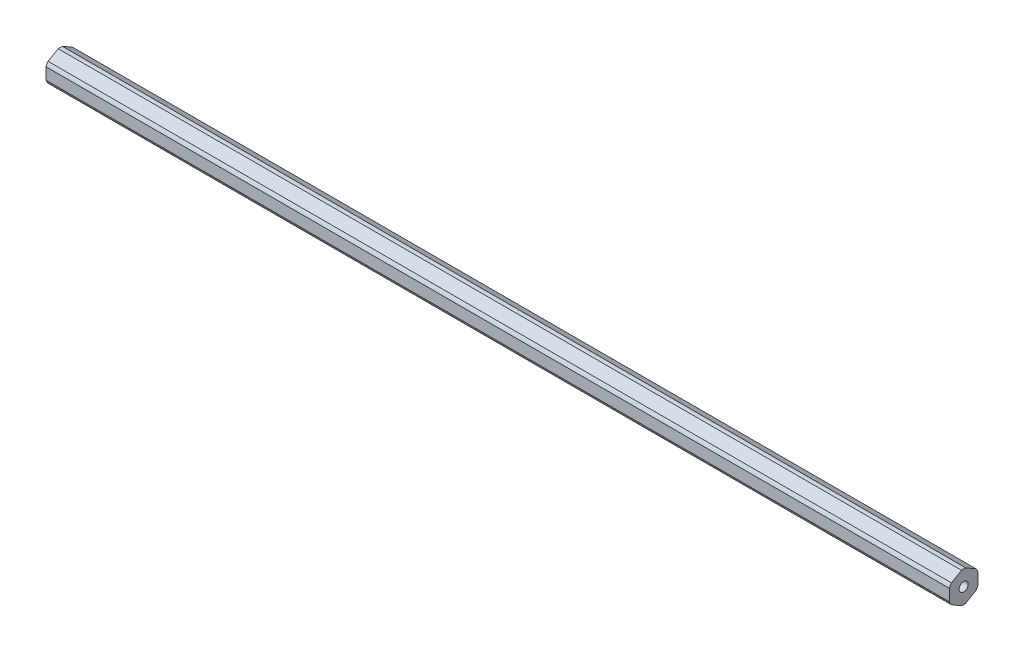
ISO-10303-21;
HEADER;
FILE_DESCRIPTION(('STEP AP214'),'2;1');
FILE_NAME('part.step','',(''),(''),'','','');
FILE_SCHEMA(('AUTOMOTIVE_DESIGN { 1 0 10303 214 1 1 1 1 }'));
ENDSEC;
DATA;
#1=APPLICATION_CONTEXT('core data for automotive mechanical design processes');
#2=APPLICATION_PROTOCOL_DEFINITION('international standard','automotive_design',2000,#1);
#3=PRODUCT_CONTEXT('',#1,'mechanical');
#4=PRODUCT('Part','Part','',(#3));
#5=PRODUCT_RELATED_PRODUCT_CATEGORY('part','',(#4));
#6=PRODUCT_DEFINITION_FORMATION('','',#4);
#7=PRODUCT_DEFINITION_CONTEXT('part definition',#1,'design');
#8=PRODUCT_DEFINITION('design','',#6,#7);
#9=PRODUCT_DEFINITION_SHAPE('','',#8);
#10=(LENGTH_UNIT() NAMED_UNIT(*) SI_UNIT(.MILLI.,.METRE.));
#11=(NAMED_UNIT(*) PLANE_ANGLE_UNIT() SI_UNIT($,.RADIAN.));
#12=(NAMED_UNIT(*) SI_UNIT($,.STERADIAN.) SOLID_ANGLE_UNIT());
#13=UNCERTAINTY_MEASURE_WITH_UNIT(LENGTH_MEASURE(1.E-05),#10,'distance_accuracy_value','');
#14=(GEOMETRIC_REPRESENTATION_CONTEXT(3) GLOBAL_UNCERTAINTY_ASSIGNED_CONTEXT((#13)) GLOBAL_UNIT_ASSIGNED_CONTEXT((#10,
#11,#12)) REPRESENTATION_CONTEXT('',''));
#15=CARTESIAN_POINT('',(0.,0.,0.));
#16=DIRECTION('',(0.,0.,1.));
#17=DIRECTION('',(1.,0.,0.));
#18=AXIS2_PLACEMENT_3D('',#15,#16,#17);
#19=CARTESIAN_POINT('',(200.025,0.,-6.35));
#20=DIRECTION('',(0.,0.,1.));
#21=DIRECTION('',(0.,-1.,0.));
#22=AXIS2_PLACEMENT_3D('',#19,#20,#21);
#23=PLANE('',#22);
#24=DIRECTION('',(0.,1.,0.));
#25=VECTOR('',#24,1.);
#26=CARTESIAN_POINT('',(-200.025,0.,-6.35));
#27=LINE('',#26,#25);
#28=CARTESIAN_POINT('',(-200.025,-2.59030191290513,-6.35));
#29=VERTEX_POINT('',#28);
#30=CARTESIAN_POINT('',(-200.025,2.59030191290514,-6.35));
#31=VERTEX_POINT('',#30);
#32=EDGE_CURVE('E169',#29,#31,#27,.T.);
#33=ORIENTED_EDGE('',*,*,#32,.T.);
#34=DIRECTION('',(-1.,0.,0.));
#35=VECTOR('',#34,1.);
#36=CARTESIAN_POINT('',(200.025,2.59030191290514,-6.35));
#37=LINE('',#36,#35);
#38=CARTESIAN_POINT('',(200.025,2.59030191290514,-6.35));
#39=VERTEX_POINT('',#38);
#40=EDGE_CURVE('E11',#39,#31,#37,.T.);
#41=ORIENTED_EDGE('',*,*,#40,.F.);
#42=DIRECTION('',(0.,1.,0.));
#43=VECTOR('',#42,1.);
#44=CARTESIAN_POINT('',(200.025,0.,-6.35));
#45=LINE('',#44,#43);
#46=CARTESIAN_POINT('',(200.025,-2.59030191290513,-6.35));
#47=VERTEX_POINT('',#46);
#48=EDGE_CURVE('E227',#47,#39,#45,.T.);
#49=ORIENTED_EDGE('',*,*,#48,.F.);
#50=DIRECTION('',(-1.,0.,0.));
#51=VECTOR('',#50,1.);
#52=CARTESIAN_POINT('',(200.025,-2.59030191290513,-6.35));
#53=LINE('',#52,#51);
#54=EDGE_CURVE('E165',#47,#29,#53,.T.);
#55=ORIENTED_EDGE('',*,*,#54,.T.);
#56=EDGE_LOOP('',(#33,#41,#49,#55));
#57=FACE_BOUND('',#56,.T.);
#58=ADVANCED_FACE('F45',(#57),#23,.F.);
#59=CARTESIAN_POINT('',(200.025,0.,0.));
#60=DIRECTION('',(-1.,0.,0.));
#61=DIRECTION('',(0.,0.,1.));
#62=AXIS2_PLACEMENT_3D('',#59,#60,#61);
#63=CYLINDRICAL_SURFACE('',#62,6.858);
#64=CARTESIAN_POINT('',(-200.025,0.,0.));
#65=DIRECTION('',(1.,0.,0.));
#66=DIRECTION('',(0.,0.,-1.));
#67=AXIS2_PLACEMENT_3D('',#64,#65,#66);
#68=CIRCLE('',#67,6.858);
#69=CARTESIAN_POINT('',(-200.025,4.20411035757862,-5.41826726004727));
#70=VERTEX_POINT('',#69);
#71=EDGE_CURVE('E172',#31,#70,#68,.T.);
#72=ORIENTED_EDGE('',*,*,#71,.T.);
#73=DIRECTION('',(-1.,0.,0.));
#74=VECTOR('',#73,1.);
#75=CARTESIAN_POINT('',(200.025,4.20411035757862,-5.41826726004727));
#76=LINE('',#75,#74);
#77=CARTESIAN_POINT('',(200.025,4.20411035757862,-5.41826726004727));
#78=VERTEX_POINT('',#77);
#79=EDGE_CURVE('E53',#78,#70,#76,.T.);
#80=ORIENTED_EDGE('',*,*,#79,.F.);
#81=CARTESIAN_POINT('',(200.025,0.,0.));
#82=DIRECTION('',(1.,0.,0.));
#83=DIRECTION('',(0.,0.,-1.));
#84=AXIS2_PLACEMENT_3D('',#81,#82,#83);
#85=CIRCLE('',#84,6.858);
#86=EDGE_CURVE('E117',#39,#78,#85,.T.);
#87=ORIENTED_EDGE('',*,*,#86,.F.);
#88=ORIENTED_EDGE('',*,*,#40,.T.);
#89=EDGE_LOOP('',(#72,#80,#87,#88));
#90=FACE_BOUND('',#89,.T.);
#91=ADVANCED_FACE('F261',(#90),#63,.T.);
#92=CARTESIAN_POINT('',(200.025,5.49926131403119,-3.175));
#93=DIRECTION('',(0.,-0.866025403784439,0.5));
#94=DIRECTION('',(0.,-0.5,-0.866025403784439));
#95=AXIS2_PLACEMENT_3D('',#92,#93,#94);
#96=PLANE('',#95);
#97=DIRECTION('',(0.,0.5,0.866025403784439));
#98=VECTOR('',#97,1.);
#99=CARTESIAN_POINT('',(-200.025,5.49926131403119,-3.175));
#100=LINE('',#99,#98);
#101=CARTESIAN_POINT('',(-200.025,6.79441227048375,-0.931732739952728));
#102=VERTEX_POINT('',#101);
#103=EDGE_CURVE('E175',#70,#102,#100,.T.);
#104=ORIENTED_EDGE('',*,*,#103,.T.);
#105=DIRECTION('',(-1.,0.,0.));
#106=VECTOR('',#105,1.);
#107=CARTESIAN_POINT('',(200.025,6.79441227048375,-0.931732739952728));
#108=LINE('',#107,#106);
#109=CARTESIAN_POINT('',(200.025,6.79441227048375,-0.931732739952728));
#110=VERTEX_POINT('',#109);
#111=EDGE_CURVE('E205',#110,#102,#108,.T.);
#112=ORIENTED_EDGE('',*,*,#111,.F.);
#113=DIRECTION('',(0.,0.5,0.866025403784439));
#114=VECTOR('',#113,1.);
#115=CARTESIAN_POINT('',(200.025,5.49926131403119,-3.175));
#116=LINE('',#115,#114);
#117=EDGE_CURVE('E213',#78,#110,#116,.T.);
#118=ORIENTED_EDGE('',*,*,#117,.F.);
#119=ORIENTED_EDGE('',*,*,#79,.T.);
#120=EDGE_LOOP('',(#104,#112,#118,#119));
#121=FACE_BOUND('',#120,.T.);
#122=ADVANCED_FACE('F211',(#121),#96,.F.);
#123=CARTESIAN_POINT('',(-200.025,6.79441227048375,0.931732739952731));
#124=VERTEX_POINT('',#123);
#125=EDGE_CURVE('E176',#102,#124,#68,.T.);
#126=ORIENTED_EDGE('',*,*,#125,.T.);
#127=DIRECTION('',(-1.,0.,0.));
#128=VECTOR('',#127,1.);
#129=CARTESIAN_POINT('',(200.025,6.79441227048375,0.931732739952731));
#130=LINE('',#129,#128);
#131=CARTESIAN_POINT('',(200.025,6.79441227048375,0.931732739952731));
#132=VERTEX_POINT('',#131);
#133=EDGE_CURVE('E202',#132,#124,#130,.T.);
#134=ORIENTED_EDGE('',*,*,#133,.F.);
#135=EDGE_CURVE('E231',#110,#132,#85,.T.);
#136=ORIENTED_EDGE('',*,*,#135,.F.);
#137=ORIENTED_EDGE('',*,*,#111,.T.);
#138=EDGE_LOOP('',(#126,#134,#136,#137));
#139=FACE_BOUND('',#138,.T.);
#140=ADVANCED_FACE('F245',(#139),#63,.T.);
#141=CARTESIAN_POINT('',(200.025,5.49926131403118,3.175));
#142=DIRECTION('',(0.,-0.866025403784439,-0.5));
#143=DIRECTION('',(0.,0.5,-0.866025403784439));
#144=AXIS2_PLACEMENT_3D('',#141,#142,#143);
#145=PLANE('',#144);
#146=DIRECTION('',(0.,-0.5,0.866025403784439));
#147=VECTOR('',#146,1.);
#148=CARTESIAN_POINT('',(-200.025,5.49926131403118,3.175));
#149=LINE('',#148,#147);
#150=CARTESIAN_POINT('',(-200.025,4.20411035757862,5.41826726004727));
#151=VERTEX_POINT('',#150);
#152=EDGE_CURVE('E178',#124,#151,#149,.T.);
#153=ORIENTED_EDGE('',*,*,#152,.T.);
#154=DIRECTION('',(-1.,0.,0.));
#155=VECTOR('',#154,1.);
#156=CARTESIAN_POINT('',(200.025,4.20411035757862,5.41826726004727));
#157=LINE('',#156,#155);
#158=CARTESIAN_POINT('',(200.025,4.20411035757862,5.41826726004727));
#159=VERTEX_POINT('',#158);
#160=EDGE_CURVE('E199',#159,#151,#157,.T.);
#161=ORIENTED_EDGE('',*,*,#160,.F.);
#162=DIRECTION('',(0.,-0.5,0.866025403784439));
#163=VECTOR('',#162,1.);
#164=CARTESIAN_POINT('',(200.025,5.49926131403118,3.175));
#165=LINE('',#164,#163);
#166=EDGE_CURVE('E236',#132,#159,#165,.T.);
#167=ORIENTED_EDGE('',*,*,#166,.F.);
#168=ORIENTED_EDGE('',*,*,#133,.T.);
#169=EDGE_LOOP('',(#153,#161,#167,#168));
#170=FACE_BOUND('',#169,.T.);
#171=ADVANCED_FACE('F247',(#170),#145,.F.);
#172=CARTESIAN_POINT('',(-200.025,2.59030191290514,6.35));
#173=VERTEX_POINT('',#172);
#174=EDGE_CURVE('E180',#151,#173,#68,.T.);
#175=ORIENTED_EDGE('',*,*,#174,.T.);
#176=DIRECTION('',(-1.,0.,0.));
#177=VECTOR('',#176,1.);
#178=CARTESIAN_POINT('',(200.025,2.59030191290514,6.35));
#179=LINE('',#178,#177);
#180=CARTESIAN_POINT('',(200.025,2.59030191290514,6.35));
#181=VERTEX_POINT('',#180);
#182=EDGE_CURVE('E196',#181,#173,#179,.T.);
#183=ORIENTED_EDGE('',*,*,#182,.F.);
#184=EDGE_CURVE('E237',#159,#181,#85,.T.);
#185=ORIENTED_EDGE('',*,*,#184,.F.);
#186=ORIENTED_EDGE('',*,*,#160,.T.);
#187=EDGE_LOOP('',(#175,#183,#185,#186));
#188=FACE_BOUND('',#187,.T.);
#189=ADVANCED_FACE('F248',(#188),#63,.T.);
#190=CARTESIAN_POINT('',(200.025,0.,6.35));
#191=DIRECTION('',(0.,0.,-1.));
#192=DIRECTION('',(0.,1.,0.));
#193=AXIS2_PLACEMENT_3D('',#190,#191,#192);
#194=PLANE('',#193);
#195=DIRECTION('',(0.,-1.,0.));
#196=VECTOR('',#195,1.);
#197=CARTESIAN_POINT('',(-200.025,0.,6.35));
#198=LINE('',#197,#196);
#199=CARTESIAN_POINT('',(-200.025,-2.59030191290514,6.35));
#200=VERTEX_POINT('',#199);
#201=EDGE_CURVE('E181',#173,#200,#198,.T.);
#202=ORIENTED_EDGE('',*,*,#201,.T.);
#203=DIRECTION('',(-1.,0.,0.));
#204=VECTOR('',#203,1.);
#205=CARTESIAN_POINT('',(200.025,-2.59030191290514,6.35));
#206=LINE('',#205,#204);
#207=CARTESIAN_POINT('',(200.025,-2.59030191290514,6.35));
#208=VERTEX_POINT('',#207);
#209=EDGE_CURVE('E193',#208,#200,#206,.T.);
#210=ORIENTED_EDGE('',*,*,#209,.F.);
#211=DIRECTION('',(0.,-1.,0.));
#212=VECTOR('',#211,1.);
#213=CARTESIAN_POINT('',(200.025,0.,6.35));
#214=LINE('',#213,#212);
#215=EDGE_CURVE('E238',#181,#208,#214,.T.);
#216=ORIENTED_EDGE('',*,*,#215,.F.);
#217=ORIENTED_EDGE('',*,*,#182,.T.);
#218=EDGE_LOOP('',(#202,#210,#216,#217));
#219=FACE_BOUND('',#218,.T.);
#220=ADVANCED_FACE('F251',(#219),#194,.F.);
#221=CARTESIAN_POINT('',(-200.025,-4.20411035757862,5.41826726004727));
#222=VERTEX_POINT('',#221);
#223=EDGE_CURVE('E183',#200,#222,#68,.T.);
#224=ORIENTED_EDGE('',*,*,#223,.T.);
#225=DIRECTION('',(-1.,0.,0.));
#226=VECTOR('',#225,1.);
#227=CARTESIAN_POINT('',(200.025,-4.20411035757862,5.41826726004727));
#228=LINE('',#227,#226);
#229=CARTESIAN_POINT('',(200.025,-4.20411035757862,5.41826726004727));
#230=VERTEX_POINT('',#229);
#231=EDGE_CURVE('E190',#230,#222,#228,.T.);
#232=ORIENTED_EDGE('',*,*,#231,.F.);
#233=EDGE_CURVE('E155',#208,#230,#85,.T.);
#234=ORIENTED_EDGE('',*,*,#233,.F.);
#235=ORIENTED_EDGE('',*,*,#209,.T.);
#236=EDGE_LOOP('',(#224,#232,#234,#235));
#237=FACE_BOUND('',#236,.T.);
#238=ADVANCED_FACE('F253',(#237),#63,.T.);
#239=CARTESIAN_POINT('',(200.025,-5.49926131403119,3.175));
#240=DIRECTION('',(0.,0.866025403784439,-0.5));
#241=DIRECTION('',(0.,0.5,0.866025403784439));
#242=AXIS2_PLACEMENT_3D('',#239,#240,#241);
#243=PLANE('',#242);
#244=DIRECTION('',(0.,-0.5,-0.866025403784439));
#245=VECTOR('',#244,1.);
#246=CARTESIAN_POINT('',(-200.025,-5.49926131403119,3.175));
#247=LINE('',#246,#245);
#248=CARTESIAN_POINT('',(-200.025,-6.79441227048375,0.931732739952726));
#249=VERTEX_POINT('',#248);
#250=EDGE_CURVE('E184',#222,#249,#247,.T.);
#251=ORIENTED_EDGE('',*,*,#250,.T.);
#252=DIRECTION('',(-1.,0.,0.));
#253=VECTOR('',#252,1.);
#254=CARTESIAN_POINT('',(200.025,-6.79441227048375,0.931732739952726));
#255=LINE('',#254,#253);
#256=CARTESIAN_POINT('',(200.025,-6.79441227048375,0.931732739952726));
#257=VERTEX_POINT('',#256);
#258=EDGE_CURVE('E160',#257,#249,#255,.T.);
#259=ORIENTED_EDGE('',*,*,#258,.F.);
#260=DIRECTION('',(0.,-0.5,-0.866025403784439));
#261=VECTOR('',#260,1.);
#262=CARTESIAN_POINT('',(200.025,-5.49926131403119,3.175));
#263=LINE('',#262,#261);
#264=EDGE_CURVE('E150',#230,#257,#263,.T.);
#265=ORIENTED_EDGE('',*,*,#264,.F.);
#266=ORIENTED_EDGE('',*,*,#231,.T.);
#267=EDGE_LOOP('',(#251,#259,#265,#266));
#268=FACE_BOUND('',#267,.T.);
#269=ADVANCED_FACE('F256',(#268),#243,.F.);
#270=CARTESIAN_POINT('',(-200.025,-6.79441227048375,-0.931732739952727));
#271=VERTEX_POINT('',#270);
#272=EDGE_CURVE('E159',#249,#271,#68,.T.);
#273=ORIENTED_EDGE('',*,*,#272,.T.);
#274=DIRECTION('',(-1.,0.,0.));
#275=VECTOR('',#274,1.);
#276=CARTESIAN_POINT('',(200.025,-6.79441227048375,-0.931732739952727));
#277=LINE('',#276,#275);
#278=CARTESIAN_POINT('',(200.025,-6.79441227048375,-0.931732739952727));
#279=VERTEX_POINT('',#278);
#280=EDGE_CURVE('E156',#279,#271,#277,.T.);
#281=ORIENTED_EDGE('',*,*,#280,.F.);
#282=EDGE_CURVE('E144',#257,#279,#85,.T.);
#283=ORIENTED_EDGE('',*,*,#282,.F.);
#284=ORIENTED_EDGE('',*,*,#258,.T.);
#285=EDGE_LOOP('',(#273,#281,#283,#284));
#286=FACE_BOUND('',#285,.T.);
#287=ADVANCED_FACE('F157',(#286),#63,.T.);
#288=CARTESIAN_POINT('',(200.025,-5.49926131403118,-3.175));
#289=DIRECTION('',(0.,0.866025403784439,0.5));
#290=DIRECTION('',(0.,-0.5,0.866025403784439));
#291=AXIS2_PLACEMENT_3D('',#288,#289,#290);
#292=PLANE('',#291);
#293=DIRECTION('',(0.,0.5,-0.866025403784439));
#294=VECTOR('',#293,1.);
#295=CARTESIAN_POINT('',(-200.025,-5.49926131403118,-3.175));
#296=LINE('',#295,#294);
#297=CARTESIAN_POINT('',(-200.025,-4.20411035757862,-5.41826726004728));
#298=VERTEX_POINT('',#297);
#299=EDGE_CURVE('E103',#271,#298,#296,.T.);
#300=ORIENTED_EDGE('',*,*,#299,.T.);
#301=DIRECTION('',(-1.,0.,0.));
#302=VECTOR('',#301,1.);
#303=CARTESIAN_POINT('',(200.025,-4.20411035757862,-5.41826726004728));
#304=LINE('',#303,#302);
#305=CARTESIAN_POINT('',(200.025,-4.20411035757862,-5.41826726004728));
#306=VERTEX_POINT('',#305);
#307=EDGE_CURVE('E161',#306,#298,#304,.T.);
#308=ORIENTED_EDGE('',*,*,#307,.F.);
#309=DIRECTION('',(0.,0.5,-0.866025403784439));
#310=VECTOR('',#309,1.);
#311=CARTESIAN_POINT('',(200.025,-5.49926131403118,-3.175));
#312=LINE('',#311,#310);
#313=EDGE_CURVE('E148',#279,#306,#312,.T.);
#314=ORIENTED_EDGE('',*,*,#313,.F.);
#315=ORIENTED_EDGE('',*,*,#280,.T.);
#316=EDGE_LOOP('',(#300,#308,#314,#315));
#317=FACE_BOUND('',#316,.T.);
#318=ADVANCED_FACE('F163',(#317),#292,.F.);
#319=EDGE_CURVE('E109',#298,#29,#68,.T.);
#320=ORIENTED_EDGE('',*,*,#319,.T.);
#321=ORIENTED_EDGE('',*,*,#54,.F.);
#322=EDGE_CURVE('E61',#306,#47,#85,.T.);
#323=ORIENTED_EDGE('',*,*,#322,.F.);
#324=ORIENTED_EDGE('',*,*,#307,.T.);
#325=EDGE_LOOP('',(#320,#321,#323,#324));
#326=FACE_BOUND('',#325,.T.);
#327=ADVANCED_FACE('F258',(#326),#63,.T.);
#328=CARTESIAN_POINT('',(200.025,0.,0.));
#329=DIRECTION('',(1.,0.,0.));
#330=DIRECTION('',(0.,0.,-1.));
#331=AXIS2_PLACEMENT_3D('',#328,#329,#330);
#332=PLANE('',#331);
#333=CARTESIAN_POINT('',(200.025,0.,0.));
#334=DIRECTION('',(1.,0.,0.));
#335=DIRECTION('',(0.,0.,-1.));
#336=AXIS2_PLACEMENT_3D('',#333,#334,#335);
#337=CIRCLE('',#336,2.01929999999999);
#338=CARTESIAN_POINT('',(200.025,0.,-2.01929999999999));
#339=VERTEX_POINT('',#338);
#340=EDGE_CURVE('E465',#339,#339,#337,.T.);
#341=ORIENTED_EDGE('',*,*,#340,.F.);
#342=EDGE_LOOP('',(#341));
#343=FACE_BOUND('',#342,.T.);
#344=ORIENTED_EDGE('',*,*,#48,.T.);
#345=ORIENTED_EDGE('',*,*,#86,.T.);
#346=ORIENTED_EDGE('',*,*,#117,.T.);
#347=ORIENTED_EDGE('',*,*,#135,.T.);
#348=ORIENTED_EDGE('',*,*,#166,.T.);
#349=ORIENTED_EDGE('',*,*,#184,.T.);
#350=ORIENTED_EDGE('',*,*,#215,.T.);
#351=ORIENTED_EDGE('',*,*,#233,.T.);
#352=ORIENTED_EDGE('',*,*,#264,.T.);
#353=ORIENTED_EDGE('',*,*,#282,.T.);
#354=ORIENTED_EDGE('',*,*,#313,.T.);
#355=ORIENTED_EDGE('',*,*,#322,.T.);
#356=EDGE_LOOP('',(#344,#345,#346,#347,#348,#349,#350,#351,#352,#353,#354,#355));
#357=FACE_BOUND('',#356,.T.);
#358=ADVANCED_FACE('F146',(#343,#357),#332,.T.);
#359=CARTESIAN_POINT('',(-200.025,0.,0.));
#360=DIRECTION('',(1.,0.,0.));
#361=DIRECTION('',(0.,0.,-1.));
#362=AXIS2_PLACEMENT_3D('',#359,#360,#361);
#363=PLANE('',#362);
#364=CARTESIAN_POINT('',(-200.025,0.,0.));
#365=DIRECTION('',(-1.,0.,0.));
#366=DIRECTION('',(0.,0.,1.));
#367=AXIS2_PLACEMENT_3D('',#364,#365,#366);
#368=CIRCLE('',#367,2.01929999999999);
#369=CARTESIAN_POINT('',(-200.025,0.,2.01929999999999));
#370=VERTEX_POINT('',#369);
#371=EDGE_CURVE('E463',#370,#370,#368,.T.);
#372=ORIENTED_EDGE('',*,*,#371,.F.);
#373=EDGE_LOOP('',(#372));
#374=FACE_BOUND('',#373,.T.);
#375=ORIENTED_EDGE('',*,*,#32,.F.);
#376=ORIENTED_EDGE('',*,*,#319,.F.);
#377=ORIENTED_EDGE('',*,*,#299,.F.);
#378=ORIENTED_EDGE('',*,*,#272,.F.);
#379=ORIENTED_EDGE('',*,*,#250,.F.);
#380=ORIENTED_EDGE('',*,*,#223,.F.);
#381=ORIENTED_EDGE('',*,*,#201,.F.);
#382=ORIENTED_EDGE('',*,*,#174,.F.);
#383=ORIENTED_EDGE('',*,*,#152,.F.);
#384=ORIENTED_EDGE('',*,*,#125,.F.);
#385=ORIENTED_EDGE('',*,*,#103,.F.);
#386=ORIENTED_EDGE('',*,*,#71,.F.);
#387=EDGE_LOOP('',(#375,#376,#377,#378,#379,#380,#381,#382,#383,#384,#385,#386));
#388=FACE_BOUND('',#387,.T.);
#389=ADVANCED_FACE('F217',(#374,#388),#363,.F.);
#390=CARTESIAN_POINT('',(183.67756,0.,0.));
#391=DIRECTION('',(1.,0.,0.));
#392=DIRECTION('',(0.,0.,-1.));
#393=AXIS2_PLACEMENT_3D('',#390,#391,#392);
#394=CONICAL_SURFACE('',#393,2.01929999999999,1.02974425867665);
#395=CARTESIAN_POINT('',(182.464242151998,0.,0.));
#396=VERTEX_POINT('',#395);
#397=VERTEX_LOOP('',#396);
#398=FACE_BOUND('',#397,.T.);
#399=CARTESIAN_POINT('',(183.67756,0.,0.));
#400=DIRECTION('',(1.,0.,0.));
#401=DIRECTION('',(0.,0.,-1.));
#402=AXIS2_PLACEMENT_3D('',#399,#400,#401);
#403=CIRCLE('',#402,2.01929999999999);
#404=CARTESIAN_POINT('',(183.67756,0.,-2.01929999999999));
#405=VERTEX_POINT('',#404);
#406=EDGE_CURVE('E173',#405,#405,#403,.T.);
#407=ORIENTED_EDGE('',*,*,#406,.T.);
#408=EDGE_LOOP('',(#407));
#409=FACE_BOUND('',#408,.T.);
#410=ADVANCED_FACE('F351',(#398,#409),#394,.F.);
#411=CARTESIAN_POINT('',(200.025,0.,0.));
#412=DIRECTION('',(1.,0.,0.));
#413=DIRECTION('',(0.,0.,-1.));
#414=AXIS2_PLACEMENT_3D('',#411,#412,#413);
#415=CYLINDRICAL_SURFACE('',#414,2.01929999999999);
#416=ORIENTED_EDGE('',*,*,#406,.F.);
#417=EDGE_LOOP('',(#416));
#418=FACE_BOUND('',#417,.T.);
#419=ORIENTED_EDGE('',*,*,#340,.T.);
#420=EDGE_LOOP('',(#419));
#421=FACE_BOUND('',#420,.T.);
#422=ADVANCED_FACE('F361',(#418,#421),#415,.F.);
#423=CARTESIAN_POINT('',(-183.67756,0.,0.));
#424=DIRECTION('',(-1.,0.,0.));
#425=DIRECTION('',(0.,0.,1.));
#426=AXIS2_PLACEMENT_3D('',#423,#424,#425);
#427=CONICAL_SURFACE('',#426,2.01929999999999,1.02974425867665);
#428=CARTESIAN_POINT('',(-182.464242151998,0.,0.));
#429=VERTEX_POINT('',#428);
#430=VERTEX_LOOP('',#429);
#431=FACE_BOUND('',#430,.T.);
#432=CARTESIAN_POINT('',(-183.67756,0.,0.));
#433=DIRECTION('',(-1.,0.,0.));
#434=DIRECTION('',(0.,0.,1.));
#435=AXIS2_PLACEMENT_3D('',#432,#433,#434);
#436=CIRCLE('',#435,2.01929999999999);
#437=CARTESIAN_POINT('',(-183.67756,0.,2.01929999999999));
#438=VERTEX_POINT('',#437);
#439=EDGE_CURVE('E460',#438,#438,#436,.T.);
#440=ORIENTED_EDGE('',*,*,#439,.T.);
#441=EDGE_LOOP('',(#440));
#442=FACE_BOUND('',#441,.T.);
#443=ADVANCED_FACE('F373',(#431,#442),#427,.F.);
#444=CARTESIAN_POINT('',(-200.025,0.,0.));
#445=DIRECTION('',(-1.,0.,0.));
#446=DIRECTION('',(0.,0.,1.));
#447=AXIS2_PLACEMENT_3D('',#444,#445,#446);
#448=CYLINDRICAL_SURFACE('',#447,2.01929999999999);
#449=ORIENTED_EDGE('',*,*,#439,.F.);
#450=EDGE_LOOP('',(#449));
#451=FACE_BOUND('',#450,.T.);
#452=ORIENTED_EDGE('',*,*,#371,.T.);
#453=EDGE_LOOP('',(#452));
#454=FACE_BOUND('',#453,.T.);
#455=ADVANCED_FACE('F386',(#451,#454),#448,.F.);
#456=CLOSED_SHELL('',(#58,#91,#122,#140,#171,#189,#220,#238,#269,#287,#318,#327,#358,#389,#410,
#422,#443,#455));
#457=MANIFOLD_SOLID_BREP('B2',#456);
#458=ADVANCED_BREP_SHAPE_REPRESENTATION('',(#18,#457),#14);
#459=SHAPE_DEFINITION_REPRESENTATION(#9,#458);
ENDSEC;
END-ISO-10303-21;
